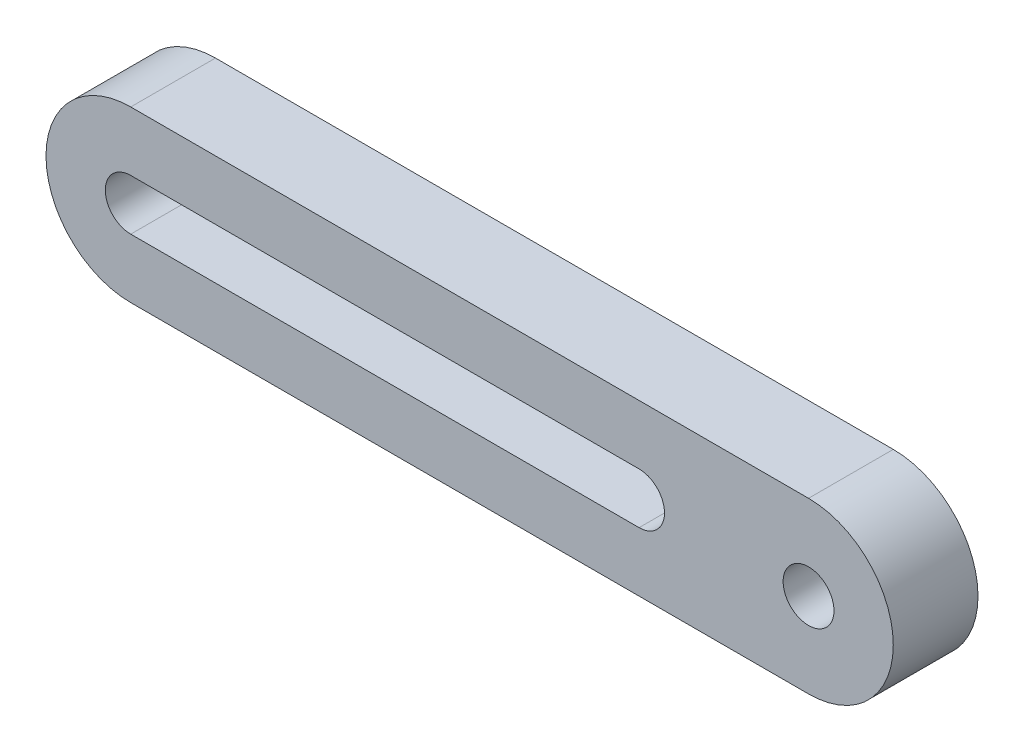
ISO-10303-21;
HEADER;
FILE_DESCRIPTION(('STEP AP214'),'2;1');
FILE_NAME('part.step','',(''),(''),'','','');
FILE_SCHEMA(('AUTOMOTIVE_DESIGN { 1 0 10303 214 1 1 1 1 }'));
ENDSEC;
DATA;
#1=APPLICATION_CONTEXT('core data for automotive mechanical design processes');
#2=APPLICATION_PROTOCOL_DEFINITION('international standard','automotive_design',2000,#1);
#3=PRODUCT_CONTEXT('',#1,'mechanical');
#4=PRODUCT('Part','Part','',(#3));
#5=PRODUCT_RELATED_PRODUCT_CATEGORY('part','',(#4));
#6=PRODUCT_DEFINITION_FORMATION('','',#4);
#7=PRODUCT_DEFINITION_CONTEXT('part definition',#1,'design');
#8=PRODUCT_DEFINITION('design','',#6,#7);
#9=PRODUCT_DEFINITION_SHAPE('','',#8);
#10=(LENGTH_UNIT() NAMED_UNIT(*) SI_UNIT(.MILLI.,.METRE.));
#11=(NAMED_UNIT(*) PLANE_ANGLE_UNIT() SI_UNIT($,.RADIAN.));
#12=(NAMED_UNIT(*) SI_UNIT($,.STERADIAN.) SOLID_ANGLE_UNIT());
#13=UNCERTAINTY_MEASURE_WITH_UNIT(LENGTH_MEASURE(1.E-05),#10,'distance_accuracy_value','');
#14=(GEOMETRIC_REPRESENTATION_CONTEXT(3) GLOBAL_UNCERTAINTY_ASSIGNED_CONTEXT((#13)) GLOBAL_UNIT_ASSIGNED_CONTEXT((#10,
#11,#12)) REPRESENTATION_CONTEXT('',''));
#15=CARTESIAN_POINT('',(0.,0.,0.));
#16=DIRECTION('',(0.,0.,1.));
#17=DIRECTION('',(1.,0.,0.));
#18=AXIS2_PLACEMENT_3D('',#15,#16,#17);
#19=CARTESIAN_POINT('',(10.,0.,5.));
#20=DIRECTION('',(0.,0.,1.));
#21=DIRECTION('',(1.,0.,0.));
#22=AXIS2_PLACEMENT_3D('',#19,#20,#21);
#23=PLANE('',#22);
#24=DIRECTION('',(1.,0.,0.));
#25=VECTOR('',#24,1.);
#26=CARTESIAN_POINT('',(-30.,-1.5,5.));
#27=LINE('',#26,#25);
#28=CARTESIAN_POINT('',(-30.,-1.5,5.));
#29=VERTEX_POINT('',#28);
#30=CARTESIAN_POINT('',(0.,-1.5,5.));
#31=VERTEX_POINT('',#30);
#32=EDGE_CURVE('E114',#29,#31,#27,.T.);
#33=ORIENTED_EDGE('',*,*,#32,.F.);
#34=CARTESIAN_POINT('',(-30.,0.,5.));
#35=DIRECTION('',(0.,0.,1.));
#36=DIRECTION('',(1.,0.,0.));
#37=AXIS2_PLACEMENT_3D('',#34,#35,#36);
#38=CIRCLE('',#37,1.5);
#39=CARTESIAN_POINT('',(-30.,1.5,5.));
#40=VERTEX_POINT('',#39);
#41=EDGE_CURVE('E105',#40,#29,#38,.T.);
#42=ORIENTED_EDGE('',*,*,#41,.F.);
#43=DIRECTION('',(-1.,0.,0.));
#44=VECTOR('',#43,1.);
#45=CARTESIAN_POINT('',(-30.,1.5,5.));
#46=LINE('',#45,#44);
#47=CARTESIAN_POINT('',(0.,1.5,5.));
#48=VERTEX_POINT('',#47);
#49=EDGE_CURVE('E132',#48,#40,#46,.T.);
#50=ORIENTED_EDGE('',*,*,#49,.F.);
#51=CARTESIAN_POINT('',(0.,0.,5.));
#52=DIRECTION('',(0.,0.,1.));
#53=DIRECTION('',(1.,0.,0.));
#54=AXIS2_PLACEMENT_3D('',#51,#52,#53);
#55=CIRCLE('',#54,1.5);
#56=EDGE_CURVE('E128',#31,#48,#55,.T.);
#57=ORIENTED_EDGE('',*,*,#56,.F.);
#58=EDGE_LOOP('',(#33,#42,#50,#57));
#59=FACE_BOUND('',#58,.T.);
#60=CARTESIAN_POINT('',(10.,0.,5.));
#61=DIRECTION('',(0.,0.,1.));
#62=DIRECTION('',(1.,0.,0.));
#63=AXIS2_PLACEMENT_3D('',#60,#61,#62);
#64=CIRCLE('',#63,5.);
#65=CARTESIAN_POINT('',(10.,-5.,5.));
#66=VERTEX_POINT('',#65);
#67=CARTESIAN_POINT('',(10.,5.,5.));
#68=VERTEX_POINT('',#67);
#69=EDGE_CURVE('E156',#66,#68,#64,.T.);
#70=ORIENTED_EDGE('',*,*,#69,.T.);
#71=DIRECTION('',(-1.,0.,0.));
#72=VECTOR('',#71,1.);
#73=CARTESIAN_POINT('',(-30.,5.,5.));
#74=LINE('',#73,#72);
#75=CARTESIAN_POINT('',(-30.,5.,5.));
#76=VERTEX_POINT('',#75);
#77=EDGE_CURVE('E160',#68,#76,#74,.T.);
#78=ORIENTED_EDGE('',*,*,#77,.T.);
#79=CARTESIAN_POINT('',(-30.,0.,5.));
#80=DIRECTION('',(0.,0.,1.));
#81=DIRECTION('',(1.,0.,0.));
#82=AXIS2_PLACEMENT_3D('',#79,#80,#81);
#83=CIRCLE('',#82,5.);
#84=CARTESIAN_POINT('',(-30.,-5.,5.));
#85=VERTEX_POINT('',#84);
#86=EDGE_CURVE('E164',#76,#85,#83,.T.);
#87=ORIENTED_EDGE('',*,*,#86,.T.);
#88=DIRECTION('',(1.,0.,0.));
#89=VECTOR('',#88,1.);
#90=CARTESIAN_POINT('',(-30.,-5.,5.));
#91=LINE('',#90,#89);
#92=EDGE_CURVE('E167',#85,#66,#91,.T.);
#93=ORIENTED_EDGE('',*,*,#92,.T.);
#94=EDGE_LOOP('',(#70,#78,#87,#93));
#95=FACE_BOUND('',#94,.T.);
#96=CARTESIAN_POINT('',(10.,0.,5.));
#97=DIRECTION('',(0.,0.,1.));
#98=DIRECTION('',(1.,0.,0.));
#99=AXIS2_PLACEMENT_3D('',#96,#97,#98);
#100=CIRCLE('',#99,1.5);
#101=CARTESIAN_POINT('',(11.5,0.,5.));
#102=VERTEX_POINT('',#101);
#103=EDGE_CURVE('E140',#102,#102,#100,.T.);
#104=ORIENTED_EDGE('',*,*,#103,.F.);
#105=EDGE_LOOP('',(#104));
#106=FACE_BOUND('',#105,.T.);
#107=ADVANCED_FACE('F39',(#59,#95,#106),#23,.T.);
#108=CARTESIAN_POINT('',(10.,0.,0.));
#109=DIRECTION('',(0.,0.,1.));
#110=DIRECTION('',(1.,0.,0.));
#111=AXIS2_PLACEMENT_3D('',#108,#109,#110);
#112=PLANE('',#111);
#113=CARTESIAN_POINT('',(10.,0.,0.));
#114=DIRECTION('',(0.,0.,1.));
#115=DIRECTION('',(1.,0.,0.));
#116=AXIS2_PLACEMENT_3D('',#113,#114,#115);
#117=CIRCLE('',#116,5.);
#118=CARTESIAN_POINT('',(10.,-5.,0.));
#119=VERTEX_POINT('',#118);
#120=CARTESIAN_POINT('',(10.,5.,0.));
#121=VERTEX_POINT('',#120);
#122=EDGE_CURVE('E123',#119,#121,#117,.T.);
#123=ORIENTED_EDGE('',*,*,#122,.F.);
#124=DIRECTION('',(1.,0.,0.));
#125=VECTOR('',#124,1.);
#126=CARTESIAN_POINT('',(-30.,-5.,0.));
#127=LINE('',#126,#125);
#128=CARTESIAN_POINT('',(-30.,-5.,0.));
#129=VERTEX_POINT('',#128);
#130=EDGE_CURVE('E161',#129,#119,#127,.T.);
#131=ORIENTED_EDGE('',*,*,#130,.F.);
#132=CARTESIAN_POINT('',(-30.,0.,0.));
#133=DIRECTION('',(0.,0.,1.));
#134=DIRECTION('',(1.,0.,0.));
#135=AXIS2_PLACEMENT_3D('',#132,#133,#134);
#136=CIRCLE('',#135,5.);
#137=CARTESIAN_POINT('',(-30.,5.,0.));
#138=VERTEX_POINT('',#137);
#139=EDGE_CURVE('E177',#138,#129,#136,.T.);
#140=ORIENTED_EDGE('',*,*,#139,.F.);
#141=DIRECTION('',(-1.,0.,0.));
#142=VECTOR('',#141,1.);
#143=CARTESIAN_POINT('',(-30.,5.,0.));
#144=LINE('',#143,#142);
#145=EDGE_CURVE('E174',#121,#138,#144,.T.);
#146=ORIENTED_EDGE('',*,*,#145,.F.);
#147=EDGE_LOOP('',(#123,#131,#140,#146));
#148=FACE_BOUND('',#147,.T.);
#149=CARTESIAN_POINT('',(-30.,0.,0.));
#150=DIRECTION('',(0.,0.,1.));
#151=DIRECTION('',(1.,0.,0.));
#152=AXIS2_PLACEMENT_3D('',#149,#150,#151);
#153=CIRCLE('',#152,1.5);
#154=CARTESIAN_POINT('',(-30.,1.5,0.));
#155=VERTEX_POINT('',#154);
#156=CARTESIAN_POINT('',(-30.,-1.5,0.));
#157=VERTEX_POINT('',#156);
#158=EDGE_CURVE('E63',#155,#157,#153,.T.);
#159=ORIENTED_EDGE('',*,*,#158,.T.);
#160=DIRECTION('',(1.,0.,0.));
#161=VECTOR('',#160,1.);
#162=CARTESIAN_POINT('',(-30.,-1.5,0.));
#163=LINE('',#162,#161);
#164=CARTESIAN_POINT('',(0.,-1.5,0.));
#165=VERTEX_POINT('',#164);
#166=EDGE_CURVE('E121',#157,#165,#163,.T.);
#167=ORIENTED_EDGE('',*,*,#166,.T.);
#168=CARTESIAN_POINT('',(0.,0.,0.));
#169=DIRECTION('',(0.,0.,1.));
#170=DIRECTION('',(1.,0.,0.));
#171=AXIS2_PLACEMENT_3D('',#168,#169,#170);
#172=CIRCLE('',#171,1.5);
#173=CARTESIAN_POINT('',(0.,1.5,0.));
#174=VERTEX_POINT('',#173);
#175=EDGE_CURVE('E143',#165,#174,#172,.T.);
#176=ORIENTED_EDGE('',*,*,#175,.T.);
#177=DIRECTION('',(-1.,0.,0.));
#178=VECTOR('',#177,1.);
#179=CARTESIAN_POINT('',(-30.,1.5,0.));
#180=LINE('',#179,#178);
#181=EDGE_CURVE('E115',#174,#155,#180,.T.);
#182=ORIENTED_EDGE('',*,*,#181,.T.);
#183=EDGE_LOOP('',(#159,#167,#176,#182));
#184=FACE_BOUND('',#183,.T.);
#185=CARTESIAN_POINT('',(10.,0.,0.));
#186=DIRECTION('',(0.,0.,1.));
#187=DIRECTION('',(1.,0.,0.));
#188=AXIS2_PLACEMENT_3D('',#185,#186,#187);
#189=CIRCLE('',#188,1.5);
#190=CARTESIAN_POINT('',(11.5,0.,0.));
#191=VERTEX_POINT('',#190);
#192=EDGE_CURVE('E253',#191,#191,#189,.T.);
#193=ORIENTED_EDGE('',*,*,#192,.T.);
#194=EDGE_LOOP('',(#193));
#195=FACE_BOUND('',#194,.T.);
#196=ADVANCED_FACE('F200',(#148,#184,#195),#112,.F.);
#197=CARTESIAN_POINT('',(10.,0.,5.));
#198=DIRECTION('',(0.,0.,-1.));
#199=DIRECTION('',(-1.,0.,0.));
#200=AXIS2_PLACEMENT_3D('',#197,#198,#199);
#201=CYLINDRICAL_SURFACE('',#200,5.);
#202=ORIENTED_EDGE('',*,*,#122,.T.);
#203=DIRECTION('',(0.,0.,-1.));
#204=VECTOR('',#203,1.);
#205=CARTESIAN_POINT('',(10.,5.,5.));
#206=LINE('',#205,#204);
#207=EDGE_CURVE('E11',#68,#121,#206,.T.);
#208=ORIENTED_EDGE('',*,*,#207,.F.);
#209=ORIENTED_EDGE('',*,*,#69,.F.);
#210=DIRECTION('',(0.,0.,-1.));
#211=VECTOR('',#210,1.);
#212=CARTESIAN_POINT('',(10.,-5.,5.));
#213=LINE('',#212,#211);
#214=EDGE_CURVE('E170',#66,#119,#213,.T.);
#215=ORIENTED_EDGE('',*,*,#214,.T.);
#216=EDGE_LOOP('',(#202,#208,#209,#215));
#217=FACE_BOUND('',#216,.T.);
#218=ADVANCED_FACE('F41',(#217),#201,.T.);
#219=CARTESIAN_POINT('',(-30.,5.,5.));
#220=DIRECTION('',(0.,-1.,0.));
#221=DIRECTION('',(1.,0.,0.));
#222=AXIS2_PLACEMENT_3D('',#219,#220,#221);
#223=PLANE('',#222);
#224=ORIENTED_EDGE('',*,*,#145,.T.);
#225=DIRECTION('',(0.,0.,-1.));
#226=VECTOR('',#225,1.);
#227=CARTESIAN_POINT('',(-30.,5.,5.));
#228=LINE('',#227,#226);
#229=EDGE_CURVE('E48',#76,#138,#228,.T.);
#230=ORIENTED_EDGE('',*,*,#229,.F.);
#231=ORIENTED_EDGE('',*,*,#77,.F.);
#232=ORIENTED_EDGE('',*,*,#207,.T.);
#233=EDGE_LOOP('',(#224,#230,#231,#232));
#234=FACE_BOUND('',#233,.T.);
#235=ADVANCED_FACE('F210',(#234),#223,.F.);
#236=CARTESIAN_POINT('',(-30.,0.,5.));
#237=DIRECTION('',(0.,0.,-1.));
#238=DIRECTION('',(-1.,0.,0.));
#239=AXIS2_PLACEMENT_3D('',#236,#237,#238);
#240=CYLINDRICAL_SURFACE('',#239,5.);
#241=ORIENTED_EDGE('',*,*,#139,.T.);
#242=DIRECTION('',(0.,0.,-1.));
#243=VECTOR('',#242,1.);
#244=CARTESIAN_POINT('',(-30.,-5.,5.));
#245=LINE('',#244,#243);
#246=EDGE_CURVE('E185',#85,#129,#245,.T.);
#247=ORIENTED_EDGE('',*,*,#246,.F.);
#248=ORIENTED_EDGE('',*,*,#86,.F.);
#249=ORIENTED_EDGE('',*,*,#229,.T.);
#250=EDGE_LOOP('',(#241,#247,#248,#249));
#251=FACE_BOUND('',#250,.T.);
#252=ADVANCED_FACE('F194',(#251),#240,.T.);
#253=CARTESIAN_POINT('',(-30.,-5.,5.));
#254=DIRECTION('',(0.,1.,0.));
#255=DIRECTION('',(0.,0.,1.));
#256=AXIS2_PLACEMENT_3D('',#253,#254,#255);
#257=PLANE('',#256);
#258=ORIENTED_EDGE('',*,*,#130,.T.);
#259=ORIENTED_EDGE('',*,*,#214,.F.);
#260=ORIENTED_EDGE('',*,*,#92,.F.);
#261=ORIENTED_EDGE('',*,*,#246,.T.);
#262=EDGE_LOOP('',(#258,#259,#260,#261));
#263=FACE_BOUND('',#262,.T.);
#264=ADVANCED_FACE('F204',(#263),#257,.F.);
#265=CARTESIAN_POINT('',(-30.,0.,5.));
#266=DIRECTION('',(0.,0.,-1.));
#267=DIRECTION('',(-1.,0.,0.));
#268=AXIS2_PLACEMENT_3D('',#265,#266,#267);
#269=CYLINDRICAL_SURFACE('',#268,1.5);
#270=ORIENTED_EDGE('',*,*,#158,.F.);
#271=DIRECTION('',(0.,0.,-1.));
#272=VECTOR('',#271,1.);
#273=CARTESIAN_POINT('',(-30.,1.5,5.));
#274=LINE('',#273,#272);
#275=EDGE_CURVE('E109',#40,#155,#274,.T.);
#276=ORIENTED_EDGE('',*,*,#275,.F.);
#277=ORIENTED_EDGE('',*,*,#41,.T.);
#278=DIRECTION('',(0.,0.,-1.));
#279=VECTOR('',#278,1.);
#280=CARTESIAN_POINT('',(-30.,-1.5,5.));
#281=LINE('',#280,#279);
#282=EDGE_CURVE('E108',#29,#157,#281,.T.);
#283=ORIENTED_EDGE('',*,*,#282,.T.);
#284=EDGE_LOOP('',(#270,#276,#277,#283));
#285=FACE_BOUND('',#284,.T.);
#286=ADVANCED_FACE('F107',(#285),#269,.F.);
#287=CARTESIAN_POINT('',(-30.,-1.5,5.));
#288=DIRECTION('',(0.,1.,0.));
#289=DIRECTION('',(0.,0.,1.));
#290=AXIS2_PLACEMENT_3D('',#287,#288,#289);
#291=PLANE('',#290);
#292=ORIENTED_EDGE('',*,*,#166,.F.);
#293=ORIENTED_EDGE('',*,*,#282,.F.);
#294=ORIENTED_EDGE('',*,*,#32,.T.);
#295=DIRECTION('',(0.,0.,-1.));
#296=VECTOR('',#295,1.);
#297=CARTESIAN_POINT('',(0.,-1.5,5.));
#298=LINE('',#297,#296);
#299=EDGE_CURVE('E124',#31,#165,#298,.T.);
#300=ORIENTED_EDGE('',*,*,#299,.T.);
#301=EDGE_LOOP('',(#292,#293,#294,#300));
#302=FACE_BOUND('',#301,.T.);
#303=ADVANCED_FACE('F118',(#302),#291,.T.);
#304=CARTESIAN_POINT('',(0.,0.,5.));
#305=DIRECTION('',(0.,0.,-1.));
#306=DIRECTION('',(-1.,0.,0.));
#307=AXIS2_PLACEMENT_3D('',#304,#305,#306);
#308=CYLINDRICAL_SURFACE('',#307,1.5);
#309=ORIENTED_EDGE('',*,*,#175,.F.);
#310=ORIENTED_EDGE('',*,*,#299,.F.);
#311=ORIENTED_EDGE('',*,*,#56,.T.);
#312=DIRECTION('',(0.,0.,-1.));
#313=VECTOR('',#312,1.);
#314=CARTESIAN_POINT('',(0.,1.5,5.));
#315=LINE('',#314,#313);
#316=EDGE_CURVE('E55',#48,#174,#315,.T.);
#317=ORIENTED_EDGE('',*,*,#316,.T.);
#318=EDGE_LOOP('',(#309,#310,#311,#317));
#319=FACE_BOUND('',#318,.T.);
#320=ADVANCED_FACE('F233',(#319),#308,.F.);
#321=CARTESIAN_POINT('',(-30.,1.5,5.));
#322=DIRECTION('',(0.,-1.,0.));
#323=DIRECTION('',(0.,0.,-1.));
#324=AXIS2_PLACEMENT_3D('',#321,#322,#323);
#325=PLANE('',#324);
#326=ORIENTED_EDGE('',*,*,#181,.F.);
#327=ORIENTED_EDGE('',*,*,#316,.F.);
#328=ORIENTED_EDGE('',*,*,#49,.T.);
#329=ORIENTED_EDGE('',*,*,#275,.T.);
#330=EDGE_LOOP('',(#326,#327,#328,#329));
#331=FACE_BOUND('',#330,.T.);
#332=ADVANCED_FACE('F237',(#331),#325,.T.);
#333=CARTESIAN_POINT('',(10.,0.,5.));
#334=DIRECTION('',(0.,0.,-1.));
#335=DIRECTION('',(-1.,0.,0.));
#336=AXIS2_PLACEMENT_3D('',#333,#334,#335);
#337=CYLINDRICAL_SURFACE('',#336,1.5);
#338=ORIENTED_EDGE('',*,*,#103,.T.);
#339=EDGE_LOOP('',(#338));
#340=FACE_BOUND('',#339,.T.);
#341=ORIENTED_EDGE('',*,*,#192,.F.);
#342=EDGE_LOOP('',(#341));
#343=FACE_BOUND('',#342,.T.);
#344=ADVANCED_FACE('F243',(#340,#343),#337,.F.);
#345=CLOSED_SHELL('',(#107,#196,#218,#235,#252,#264,#286,#303,#320,#332,#344));
#346=MANIFOLD_SOLID_BREP('B2',#345);
#347=ADVANCED_BREP_SHAPE_REPRESENTATION('',(#18,#346),#14);
#348=SHAPE_DEFINITION_REPRESENTATION(#9,#347);
ENDSEC;
END-ISO-10303-21;
